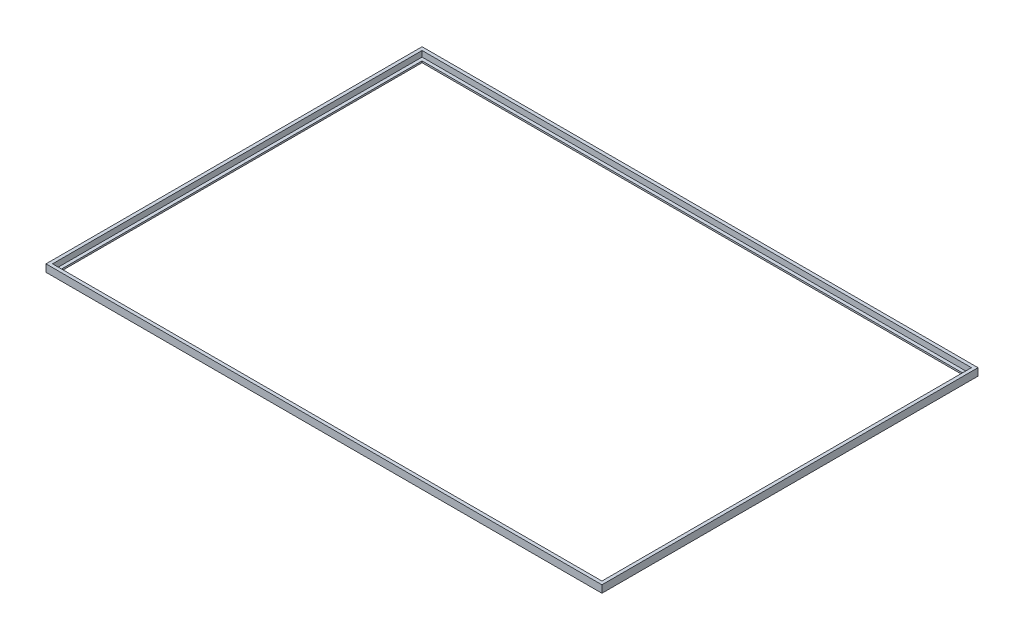
ISO-10303-21;
HEADER;
FILE_DESCRIPTION(('STEP AP214'),'2;1');
FILE_NAME('part.step','',(''),(''),'','','');
FILE_SCHEMA(('AUTOMOTIVE_DESIGN { 1 0 10303 214 1 1 1 1 }'));
ENDSEC;
DATA;
#1=APPLICATION_CONTEXT('core data for automotive mechanical design processes');
#2=APPLICATION_PROTOCOL_DEFINITION('international standard','automotive_design',2000,#1);
#3=PRODUCT_CONTEXT('',#1,'mechanical');
#4=PRODUCT('Part','Part','',(#3));
#5=PRODUCT_RELATED_PRODUCT_CATEGORY('part','',(#4));
#6=PRODUCT_DEFINITION_FORMATION('','',#4);
#7=PRODUCT_DEFINITION_CONTEXT('part definition',#1,'design');
#8=PRODUCT_DEFINITION('design','',#6,#7);
#9=PRODUCT_DEFINITION_SHAPE('','',#8);
#10=(LENGTH_UNIT() NAMED_UNIT(*) SI_UNIT(.MILLI.,.METRE.));
#11=(NAMED_UNIT(*) PLANE_ANGLE_UNIT() SI_UNIT($,.RADIAN.));
#12=(NAMED_UNIT(*) SI_UNIT($,.STERADIAN.) SOLID_ANGLE_UNIT());
#13=UNCERTAINTY_MEASURE_WITH_UNIT(LENGTH_MEASURE(1.E-05),#10,'distance_accuracy_value','');
#14=(GEOMETRIC_REPRESENTATION_CONTEXT(3) GLOBAL_UNCERTAINTY_ASSIGNED_CONTEXT((#13)) GLOBAL_UNIT_ASSIGNED_CONTEXT((#10,
#11,#12)) REPRESENTATION_CONTEXT('',''));
#15=CARTESIAN_POINT('',(0.,0.,0.));
#16=DIRECTION('',(0.,0.,1.));
#17=DIRECTION('',(1.,0.,0.));
#18=AXIS2_PLACEMENT_3D('',#15,#16,#17);
#19=CARTESIAN_POINT('',(2.,2.75,-2.));
#20=DIRECTION('',(1.,0.,0.));
#21=DIRECTION('',(0.,0.,-1.));
#22=AXIS2_PLACEMENT_3D('',#19,#20,#21);
#23=PLANE('',#22);
#24=DIRECTION('',(0.,-1.,0.));
#25=VECTOR('',#24,1.);
#26=CARTESIAN_POINT('',(2.,2.75,-2.));
#27=LINE('',#26,#25);
#28=CARTESIAN_POINT('',(2.,1.,-2.));
#29=VERTEX_POINT('',#28);
#30=CARTESIAN_POINT('',(2.,0.5,-2.));
#31=VERTEX_POINT('',#30);
#32=EDGE_CURVE('E209',#29,#31,#27,.T.);
#33=ORIENTED_EDGE('',*,*,#32,.T.);
#34=DIRECTION('',(0.,0.,-1.));
#35=VECTOR('',#34,1.);
#36=CARTESIAN_POINT('',(2.,0.5,-2.));
#37=LINE('',#36,#35);
#38=CARTESIAN_POINT('',(2.,0.5,-113.));
#39=VERTEX_POINT('',#38);
#40=EDGE_CURVE('E256',#31,#39,#37,.T.);
#41=ORIENTED_EDGE('',*,*,#40,.T.);
#42=DIRECTION('',(0.,-1.,0.));
#43=VECTOR('',#42,1.);
#44=CARTESIAN_POINT('',(2.,2.75,-113.));
#45=LINE('',#44,#43);
#46=CARTESIAN_POINT('',(2.,1.,-113.));
#47=VERTEX_POINT('',#46);
#48=EDGE_CURVE('E200',#47,#39,#45,.T.);
#49=ORIENTED_EDGE('',*,*,#48,.F.);
#50=DIRECTION('',(0.,0.,1.));
#51=VECTOR('',#50,1.);
#52=CARTESIAN_POINT('',(2.,1.,-2.));
#53=LINE('',#52,#51);
#54=EDGE_CURVE('E197',#47,#29,#53,.T.);
#55=ORIENTED_EDGE('',*,*,#54,.T.);
#56=EDGE_LOOP('',(#33,#41,#49,#55));
#57=FACE_BOUND('',#56,.T.);
#58=ADVANCED_FACE('F32',(#57),#23,.T.);
#59=CARTESIAN_POINT('',(2.,2.75,-2.));
#60=DIRECTION('',(0.,0.,-1.));
#61=DIRECTION('',(-1.,0.,0.));
#62=AXIS2_PLACEMENT_3D('',#59,#60,#61);
#63=PLANE('',#62);
#64=DIRECTION('',(0.,-1.,0.));
#65=VECTOR('',#64,1.);
#66=CARTESIAN_POINT('',(168.,2.75,-2.));
#67=LINE('',#66,#65);
#68=CARTESIAN_POINT('',(168.,1.,-2.));
#69=VERTEX_POINT('',#68);
#70=CARTESIAN_POINT('',(168.,0.5,-2.));
#71=VERTEX_POINT('',#70);
#72=EDGE_CURVE('E206',#69,#71,#67,.T.);
#73=ORIENTED_EDGE('',*,*,#72,.T.);
#74=DIRECTION('',(-1.,0.,0.));
#75=VECTOR('',#74,1.);
#76=CARTESIAN_POINT('',(2.,0.5,-2.));
#77=LINE('',#76,#75);
#78=EDGE_CURVE('E254',#71,#31,#77,.T.);
#79=ORIENTED_EDGE('',*,*,#78,.T.);
#80=ORIENTED_EDGE('',*,*,#32,.F.);
#81=DIRECTION('',(1.,0.,0.));
#82=VECTOR('',#81,1.);
#83=CARTESIAN_POINT('',(2.,1.,-2.));
#84=LINE('',#83,#82);
#85=EDGE_CURVE('E194',#29,#69,#84,.T.);
#86=ORIENTED_EDGE('',*,*,#85,.T.);
#87=EDGE_LOOP('',(#73,#79,#80,#86));
#88=FACE_BOUND('',#87,.T.);
#89=ADVANCED_FACE('F323',(#88),#63,.T.);
#90=CARTESIAN_POINT('',(168.,2.75,-2.));
#91=DIRECTION('',(-1.,0.,0.));
#92=DIRECTION('',(0.,0.,1.));
#93=AXIS2_PLACEMENT_3D('',#90,#91,#92);
#94=PLANE('',#93);
#95=DIRECTION('',(0.,-1.,0.));
#96=VECTOR('',#95,1.);
#97=CARTESIAN_POINT('',(168.,2.75,-113.));
#98=LINE('',#97,#96);
#99=CARTESIAN_POINT('',(168.,1.,-113.));
#100=VERTEX_POINT('',#99);
#101=CARTESIAN_POINT('',(168.,0.5,-113.));
#102=VERTEX_POINT('',#101);
#103=EDGE_CURVE('E203',#100,#102,#98,.T.);
#104=ORIENTED_EDGE('',*,*,#103,.T.);
#105=DIRECTION('',(0.,0.,1.));
#106=VECTOR('',#105,1.);
#107=CARTESIAN_POINT('',(168.,0.5,-2.));
#108=LINE('',#107,#106);
#109=EDGE_CURVE('E251',#102,#71,#108,.T.);
#110=ORIENTED_EDGE('',*,*,#109,.T.);
#111=ORIENTED_EDGE('',*,*,#72,.F.);
#112=DIRECTION('',(0.,0.,-1.));
#113=VECTOR('',#112,1.);
#114=CARTESIAN_POINT('',(168.,1.,-2.));
#115=LINE('',#114,#113);
#116=EDGE_CURVE('E188',#69,#100,#115,.T.);
#117=ORIENTED_EDGE('',*,*,#116,.T.);
#118=EDGE_LOOP('',(#104,#110,#111,#117));
#119=FACE_BOUND('',#118,.T.);
#120=ADVANCED_FACE('F329',(#119),#94,.T.);
#121=CARTESIAN_POINT('',(2.,2.75,-113.));
#122=DIRECTION('',(0.,0.,1.));
#123=DIRECTION('',(1.,0.,0.));
#124=AXIS2_PLACEMENT_3D('',#121,#122,#123);
#125=PLANE('',#124);
#126=ORIENTED_EDGE('',*,*,#48,.T.);
#127=DIRECTION('',(1.,0.,0.));
#128=VECTOR('',#127,1.);
#129=CARTESIAN_POINT('',(2.,0.5,-113.));
#130=LINE('',#129,#128);
#131=EDGE_CURVE('E258',#39,#102,#130,.T.);
#132=ORIENTED_EDGE('',*,*,#131,.T.);
#133=ORIENTED_EDGE('',*,*,#103,.F.);
#134=DIRECTION('',(-1.,0.,0.));
#135=VECTOR('',#134,1.);
#136=CARTESIAN_POINT('',(2.,1.,-113.));
#137=LINE('',#136,#135);
#138=EDGE_CURVE('E230',#100,#47,#137,.T.);
#139=ORIENTED_EDGE('',*,*,#138,.T.);
#140=EDGE_LOOP('',(#126,#132,#133,#139));
#141=FACE_BOUND('',#140,.T.);
#142=ADVANCED_FACE('F335',(#141),#125,.T.);
#143=CARTESIAN_POINT('',(0.,2.75,0.));
#144=DIRECTION('',(0.,-1.,0.));
#145=DIRECTION('',(0.,0.,-1.));
#146=AXIS2_PLACEMENT_3D('',#143,#144,#145);
#147=PLANE('',#146);
#148=DIRECTION('',(0.,0.,-1.));
#149=VECTOR('',#148,1.);
#150=CARTESIAN_POINT('',(169.,2.75,-1.));
#151=LINE('',#150,#149);
#152=CARTESIAN_POINT('',(169.,2.75,-1.));
#153=VERTEX_POINT('',#152);
#154=CARTESIAN_POINT('',(169.,2.75,-114.));
#155=VERTEX_POINT('',#154);
#156=EDGE_CURVE('E181',#153,#155,#151,.T.);
#157=ORIENTED_EDGE('',*,*,#156,.F.);
#158=DIRECTION('',(1.,0.,0.));
#159=VECTOR('',#158,1.);
#160=CARTESIAN_POINT('',(1.,2.75,-1.));
#161=LINE('',#160,#159);
#162=CARTESIAN_POINT('',(1.,2.75,-1.));
#163=VERTEX_POINT('',#162);
#164=EDGE_CURVE('E155',#163,#153,#161,.T.);
#165=ORIENTED_EDGE('',*,*,#164,.F.);
#166=DIRECTION('',(0.,0.,1.));
#167=VECTOR('',#166,1.);
#168=CARTESIAN_POINT('',(1.,2.75,-114.));
#169=LINE('',#168,#167);
#170=CARTESIAN_POINT('',(1.,2.75,-114.));
#171=VERTEX_POINT('',#170);
#172=EDGE_CURVE('E172',#171,#163,#169,.T.);
#173=ORIENTED_EDGE('',*,*,#172,.F.);
#174=DIRECTION('',(-1.,0.,0.));
#175=VECTOR('',#174,1.);
#176=CARTESIAN_POINT('',(169.,2.75,-114.));
#177=LINE('',#176,#175);
#178=EDGE_CURVE('E175',#155,#171,#177,.T.);
#179=ORIENTED_EDGE('',*,*,#178,.F.);
#180=EDGE_LOOP('',(#157,#165,#173,#179));
#181=FACE_BOUND('',#180,.T.);
#182=DIRECTION('',(0.,0.,1.));
#183=VECTOR('',#182,1.);
#184=CARTESIAN_POINT('',(0.,2.75,0.));
#185=LINE('',#184,#183);
#186=CARTESIAN_POINT('',(0.,2.75,-115.));
#187=VERTEX_POINT('',#186);
#188=CARTESIAN_POINT('',(0.,2.75,0.));
#189=VERTEX_POINT('',#188);
#190=EDGE_CURVE('E212',#187,#189,#185,.T.);
#191=ORIENTED_EDGE('',*,*,#190,.T.);
#192=DIRECTION('',(1.,0.,0.));
#193=VECTOR('',#192,1.);
#194=CARTESIAN_POINT('',(0.,2.75,0.));
#195=LINE('',#194,#193);
#196=CARTESIAN_POINT('',(170.,2.75,0.));
#197=VERTEX_POINT('',#196);
#198=EDGE_CURVE('E215',#189,#197,#195,.T.);
#199=ORIENTED_EDGE('',*,*,#198,.T.);
#200=DIRECTION('',(0.,0.,-1.));
#201=VECTOR('',#200,1.);
#202=CARTESIAN_POINT('',(170.,2.75,0.));
#203=LINE('',#202,#201);
#204=CARTESIAN_POINT('',(170.,2.75,-115.));
#205=VERTEX_POINT('',#204);
#206=EDGE_CURVE('E217',#197,#205,#203,.T.);
#207=ORIENTED_EDGE('',*,*,#206,.T.);
#208=DIRECTION('',(-1.,0.,0.));
#209=VECTOR('',#208,1.);
#210=CARTESIAN_POINT('',(0.,2.75,-115.));
#211=LINE('',#210,#209);
#212=EDGE_CURVE('E219',#205,#187,#211,.T.);
#213=ORIENTED_EDGE('',*,*,#212,.T.);
#214=EDGE_LOOP('',(#191,#199,#207,#213));
#215=FACE_BOUND('',#214,.T.);
#216=ADVANCED_FACE('F307',(#181,#215),#147,.F.);
#217=CARTESIAN_POINT('',(0.,0.,0.));
#218=DIRECTION('',(0.,-1.,0.));
#219=DIRECTION('',(0.,0.,-1.));
#220=AXIS2_PLACEMENT_3D('',#217,#218,#219);
#221=PLANE('',#220);
#222=DIRECTION('',(1.,0.,0.));
#223=VECTOR('',#222,1.);
#224=CARTESIAN_POINT('',(0.,0.,-1.5));
#225=LINE('',#224,#223);
#226=CARTESIAN_POINT('',(1.5,0.,-1.5));
#227=VERTEX_POINT('',#226);
#228=CARTESIAN_POINT('',(168.5,0.,-1.5));
#229=VERTEX_POINT('',#228);
#230=EDGE_CURVE('E246',#227,#229,#225,.T.);
#231=ORIENTED_EDGE('',*,*,#230,.T.);
#232=DIRECTION('',(0.,0.,-1.));
#233=VECTOR('',#232,1.);
#234=CARTESIAN_POINT('',(168.5,0.,0.));
#235=LINE('',#234,#233);
#236=CARTESIAN_POINT('',(168.5,0.,-113.5));
#237=VERTEX_POINT('',#236);
#238=EDGE_CURVE('E248',#229,#237,#235,.T.);
#239=ORIENTED_EDGE('',*,*,#238,.T.);
#240=DIRECTION('',(-1.,0.,0.));
#241=VECTOR('',#240,1.);
#242=CARTESIAN_POINT('',(0.,0.,-113.5));
#243=LINE('',#242,#241);
#244=CARTESIAN_POINT('',(1.5,0.,-113.5));
#245=VERTEX_POINT('',#244);
#246=EDGE_CURVE('E242',#237,#245,#243,.T.);
#247=ORIENTED_EDGE('',*,*,#246,.T.);
#248=DIRECTION('',(0.,0.,1.));
#249=VECTOR('',#248,1.);
#250=CARTESIAN_POINT('',(1.5,0.,0.));
#251=LINE('',#250,#249);
#252=EDGE_CURVE('E244',#245,#227,#251,.T.);
#253=ORIENTED_EDGE('',*,*,#252,.T.);
#254=EDGE_LOOP('',(#231,#239,#247,#253));
#255=FACE_BOUND('',#254,.T.);
#256=DIRECTION('',(0.,0.,1.));
#257=VECTOR('',#256,1.);
#258=CARTESIAN_POINT('',(169.5,0.,0.));
#259=LINE('',#258,#257);
#260=CARTESIAN_POINT('',(169.5,0.,-114.5));
#261=VERTEX_POINT('',#260);
#262=CARTESIAN_POINT('',(169.5,0.,-0.5));
#263=VERTEX_POINT('',#262);
#264=EDGE_CURVE('E237',#261,#263,#259,.T.);
#265=ORIENTED_EDGE('',*,*,#264,.T.);
#266=DIRECTION('',(-1.,0.,0.));
#267=VECTOR('',#266,1.);
#268=CARTESIAN_POINT('',(0.,0.,-0.5));
#269=LINE('',#268,#267);
#270=CARTESIAN_POINT('',(0.5,0.,-0.5));
#271=VERTEX_POINT('',#270);
#272=EDGE_CURVE('E239',#263,#271,#269,.T.);
#273=ORIENTED_EDGE('',*,*,#272,.T.);
#274=DIRECTION('',(0.,0.,-1.));
#275=VECTOR('',#274,1.);
#276=CARTESIAN_POINT('',(0.5,0.,-115.));
#277=LINE('',#276,#275);
#278=CARTESIAN_POINT('',(0.5,0.,-114.5));
#279=VERTEX_POINT('',#278);
#280=EDGE_CURVE('E233',#271,#279,#277,.T.);
#281=ORIENTED_EDGE('',*,*,#280,.T.);
#282=DIRECTION('',(1.,0.,0.));
#283=VECTOR('',#282,1.);
#284=CARTESIAN_POINT('',(170.,0.,-114.5));
#285=LINE('',#284,#283);
#286=EDGE_CURVE('E235',#279,#261,#285,.T.);
#287=ORIENTED_EDGE('',*,*,#286,.T.);
#288=EDGE_LOOP('',(#265,#273,#281,#287));
#289=FACE_BOUND('',#288,.T.);
#290=ADVANCED_FACE('F292',(#255,#289),#221,.T.);
#291=CARTESIAN_POINT('',(0.,2.75,0.));
#292=DIRECTION('',(1.,0.,0.));
#293=DIRECTION('',(0.,0.,-1.));
#294=AXIS2_PLACEMENT_3D('',#291,#292,#293);
#295=PLANE('',#294);
#296=DIRECTION('',(0.,-1.,0.));
#297=VECTOR('',#296,1.);
#298=CARTESIAN_POINT('',(0.,2.75,-115.));
#299=LINE('',#298,#297);
#300=CARTESIAN_POINT('',(0.,0.5,-115.));
#301=VERTEX_POINT('',#300);
#302=EDGE_CURVE('E221',#187,#301,#299,.T.);
#303=ORIENTED_EDGE('',*,*,#302,.T.);
#304=DIRECTION('',(0.,0.,1.));
#305=VECTOR('',#304,1.);
#306=CARTESIAN_POINT('',(0.,0.5,0.));
#307=LINE('',#306,#305);
#308=CARTESIAN_POINT('',(0.,0.5,0.));
#309=VERTEX_POINT('',#308);
#310=EDGE_CURVE('E11',#301,#309,#307,.T.);
#311=ORIENTED_EDGE('',*,*,#310,.T.);
#312=DIRECTION('',(0.,-1.,0.));
#313=VECTOR('',#312,1.);
#314=CARTESIAN_POINT('',(0.,2.75,0.));
#315=LINE('',#314,#313);
#316=EDGE_CURVE('E227',#189,#309,#315,.T.);
#317=ORIENTED_EDGE('',*,*,#316,.F.);
#318=ORIENTED_EDGE('',*,*,#190,.F.);
#319=EDGE_LOOP('',(#303,#311,#317,#318));
#320=FACE_BOUND('',#319,.T.);
#321=ADVANCED_FACE('F310',(#320),#295,.F.);
#322=CARTESIAN_POINT('',(0.,2.75,0.));
#323=DIRECTION('',(0.,0.,-1.));
#324=DIRECTION('',(-1.,0.,0.));
#325=AXIS2_PLACEMENT_3D('',#322,#323,#324);
#326=PLANE('',#325);
#327=ORIENTED_EDGE('',*,*,#316,.T.);
#328=DIRECTION('',(1.,0.,0.));
#329=VECTOR('',#328,1.);
#330=CARTESIAN_POINT('',(170.,0.5,0.));
#331=LINE('',#330,#329);
#332=CARTESIAN_POINT('',(170.,0.5,0.));
#333=VERTEX_POINT('',#332);
#334=EDGE_CURVE('E260',#309,#333,#331,.T.);
#335=ORIENTED_EDGE('',*,*,#334,.T.);
#336=DIRECTION('',(0.,-1.,0.));
#337=VECTOR('',#336,1.);
#338=CARTESIAN_POINT('',(170.,2.75,0.));
#339=LINE('',#338,#337);
#340=EDGE_CURVE('E225',#197,#333,#339,.T.);
#341=ORIENTED_EDGE('',*,*,#340,.F.);
#342=ORIENTED_EDGE('',*,*,#198,.F.);
#343=EDGE_LOOP('',(#327,#335,#341,#342));
#344=FACE_BOUND('',#343,.T.);
#345=ADVANCED_FACE('F301',(#344),#326,.F.);
#346=CARTESIAN_POINT('',(170.,2.75,0.));
#347=DIRECTION('',(-1.,0.,0.));
#348=DIRECTION('',(0.,0.,1.));
#349=AXIS2_PLACEMENT_3D('',#346,#347,#348);
#350=PLANE('',#349);
#351=ORIENTED_EDGE('',*,*,#340,.T.);
#352=DIRECTION('',(0.,0.,-1.));
#353=VECTOR('',#352,1.);
#354=CARTESIAN_POINT('',(170.,0.5,-115.));
#355=LINE('',#354,#353);
#356=CARTESIAN_POINT('',(170.,0.5,-115.));
#357=VERTEX_POINT('',#356);
#358=EDGE_CURVE('E56',#333,#357,#355,.T.);
#359=ORIENTED_EDGE('',*,*,#358,.T.);
#360=DIRECTION('',(0.,-1.,0.));
#361=VECTOR('',#360,1.);
#362=CARTESIAN_POINT('',(170.,2.75,-115.));
#363=LINE('',#362,#361);
#364=EDGE_CURVE('E223',#205,#357,#363,.T.);
#365=ORIENTED_EDGE('',*,*,#364,.F.);
#366=ORIENTED_EDGE('',*,*,#206,.F.);
#367=EDGE_LOOP('',(#351,#359,#365,#366));
#368=FACE_BOUND('',#367,.T.);
#369=ADVANCED_FACE('F304',(#368),#350,.F.);
#370=CARTESIAN_POINT('',(0.,2.75,-115.));
#371=DIRECTION('',(0.,0.,1.));
#372=DIRECTION('',(1.,0.,0.));
#373=AXIS2_PLACEMENT_3D('',#370,#371,#372);
#374=PLANE('',#373);
#375=ORIENTED_EDGE('',*,*,#364,.T.);
#376=DIRECTION('',(-1.,0.,0.));
#377=VECTOR('',#376,1.);
#378=CARTESIAN_POINT('',(0.,0.5,-115.));
#379=LINE('',#378,#377);
#380=EDGE_CURVE('E41',#357,#301,#379,.T.);
#381=ORIENTED_EDGE('',*,*,#380,.T.);
#382=ORIENTED_EDGE('',*,*,#302,.F.);
#383=ORIENTED_EDGE('',*,*,#212,.F.);
#384=EDGE_LOOP('',(#375,#381,#382,#383));
#385=FACE_BOUND('',#384,.T.);
#386=ADVANCED_FACE('F311',(#385),#374,.F.);
#387=CARTESIAN_POINT('',(1.,1.,-1.));
#388=DIRECTION('',(0.,0.,1.));
#389=DIRECTION('',(1.,0.,0.));
#390=AXIS2_PLACEMENT_3D('',#387,#388,#389);
#391=PLANE('',#390);
#392=ORIENTED_EDGE('',*,*,#164,.T.);
#393=DIRECTION('',(0.,1.,0.));
#394=VECTOR('',#393,1.);
#395=CARTESIAN_POINT('',(169.,1.,-1.));
#396=LINE('',#395,#394);
#397=CARTESIAN_POINT('',(169.,1.,-1.));
#398=VERTEX_POINT('',#397);
#399=EDGE_CURVE('E148',#398,#153,#396,.T.);
#400=ORIENTED_EDGE('',*,*,#399,.F.);
#401=DIRECTION('',(1.,0.,0.));
#402=VECTOR('',#401,1.);
#403=CARTESIAN_POINT('',(1.,1.,-1.));
#404=LINE('',#403,#402);
#405=CARTESIAN_POINT('',(1.,1.,-1.));
#406=VERTEX_POINT('',#405);
#407=EDGE_CURVE('E152',#406,#398,#404,.T.);
#408=ORIENTED_EDGE('',*,*,#407,.F.);
#409=DIRECTION('',(0.,1.,0.));
#410=VECTOR('',#409,1.);
#411=CARTESIAN_POINT('',(1.,1.,-1.));
#412=LINE('',#411,#410);
#413=EDGE_CURVE('E186',#406,#163,#412,.T.);
#414=ORIENTED_EDGE('',*,*,#413,.T.);
#415=EDGE_LOOP('',(#392,#400,#408,#414));
#416=FACE_BOUND('',#415,.T.);
#417=ADVANCED_FACE('F150',(#416),#391,.F.);
#418=CARTESIAN_POINT('',(1.,1.,-114.));
#419=DIRECTION('',(-1.,0.,0.));
#420=DIRECTION('',(0.,0.,1.));
#421=AXIS2_PLACEMENT_3D('',#418,#419,#420);
#422=PLANE('',#421);
#423=ORIENTED_EDGE('',*,*,#172,.T.);
#424=ORIENTED_EDGE('',*,*,#413,.F.);
#425=DIRECTION('',(0.,0.,1.));
#426=VECTOR('',#425,1.);
#427=CARTESIAN_POINT('',(1.,1.,-114.));
#428=LINE('',#427,#426);
#429=CARTESIAN_POINT('',(1.,1.,-114.));
#430=VERTEX_POINT('',#429);
#431=EDGE_CURVE('E160',#430,#406,#428,.T.);
#432=ORIENTED_EDGE('',*,*,#431,.F.);
#433=DIRECTION('',(0.,1.,0.));
#434=VECTOR('',#433,1.);
#435=CARTESIAN_POINT('',(1.,1.,-114.));
#436=LINE('',#435,#434);
#437=EDGE_CURVE('E189',#430,#171,#436,.T.);
#438=ORIENTED_EDGE('',*,*,#437,.T.);
#439=EDGE_LOOP('',(#423,#424,#432,#438));
#440=FACE_BOUND('',#439,.T.);
#441=ADVANCED_FACE('F318',(#440),#422,.F.);
#442=CARTESIAN_POINT('',(169.,1.,-114.));
#443=DIRECTION('',(0.,0.,-1.));
#444=DIRECTION('',(-1.,0.,0.));
#445=AXIS2_PLACEMENT_3D('',#442,#443,#444);
#446=PLANE('',#445);
#447=ORIENTED_EDGE('',*,*,#178,.T.);
#448=ORIENTED_EDGE('',*,*,#437,.F.);
#449=DIRECTION('',(-1.,0.,0.));
#450=VECTOR('',#449,1.);
#451=CARTESIAN_POINT('',(169.,1.,-114.));
#452=LINE('',#451,#450);
#453=CARTESIAN_POINT('',(169.,1.,-114.));
#454=VERTEX_POINT('',#453);
#455=EDGE_CURVE('E168',#454,#430,#452,.T.);
#456=ORIENTED_EDGE('',*,*,#455,.F.);
#457=DIRECTION('',(0.,1.,0.));
#458=VECTOR('',#457,1.);
#459=CARTESIAN_POINT('',(169.,1.,-114.));
#460=LINE('',#459,#458);
#461=EDGE_CURVE('E159',#454,#155,#460,.T.);
#462=ORIENTED_EDGE('',*,*,#461,.T.);
#463=EDGE_LOOP('',(#447,#448,#456,#462));
#464=FACE_BOUND('',#463,.T.);
#465=ADVANCED_FACE('F378',(#464),#446,.F.);
#466=CARTESIAN_POINT('',(169.,1.,-1.));
#467=DIRECTION('',(1.,0.,0.));
#468=DIRECTION('',(0.,0.,-1.));
#469=AXIS2_PLACEMENT_3D('',#466,#467,#468);
#470=PLANE('',#469);
#471=ORIENTED_EDGE('',*,*,#156,.T.);
#472=ORIENTED_EDGE('',*,*,#461,.F.);
#473=DIRECTION('',(0.,0.,-1.));
#474=VECTOR('',#473,1.);
#475=CARTESIAN_POINT('',(169.,1.,-1.));
#476=LINE('',#475,#474);
#477=EDGE_CURVE('E163',#398,#454,#476,.T.);
#478=ORIENTED_EDGE('',*,*,#477,.F.);
#479=ORIENTED_EDGE('',*,*,#399,.T.);
#480=EDGE_LOOP('',(#471,#472,#478,#479));
#481=FACE_BOUND('',#480,.T.);
#482=ADVANCED_FACE('F164',(#481),#470,.F.);
#483=CARTESIAN_POINT('',(0.,1.,0.));
#484=DIRECTION('',(0.,1.,0.));
#485=DIRECTION('',(0.,0.,1.));
#486=AXIS2_PLACEMENT_3D('',#483,#484,#485);
#487=PLANE('',#486);
#488=ORIENTED_EDGE('',*,*,#138,.F.);
#489=ORIENTED_EDGE('',*,*,#116,.F.);
#490=ORIENTED_EDGE('',*,*,#85,.F.);
#491=ORIENTED_EDGE('',*,*,#54,.F.);
#492=EDGE_LOOP('',(#488,#489,#490,#491));
#493=FACE_BOUND('',#492,.T.);
#494=ORIENTED_EDGE('',*,*,#407,.T.);
#495=ORIENTED_EDGE('',*,*,#477,.T.);
#496=ORIENTED_EDGE('',*,*,#455,.T.);
#497=ORIENTED_EDGE('',*,*,#431,.T.);
#498=EDGE_LOOP('',(#494,#495,#496,#497));
#499=FACE_BOUND('',#498,.T.);
#500=ADVANCED_FACE('F170',(#493,#499),#487,.T.);
#501=CARTESIAN_POINT('',(1.5,0.,0.));
#502=DIRECTION('',(-0.707106781186547,0.707106781186547,0.));
#503=DIRECTION('',(0.,0.,1.));
#504=AXIS2_PLACEMENT_3D('',#501,#502,#503);
#505=PLANE('',#504);
#506=DIRECTION('',(-0.577350269189626,-0.577350269189626,-0.577350269189626));
#507=VECTOR('',#506,1.);
#508=CARTESIAN_POINT('',(39.3333333333333,37.8333333333333,-75.6666666666667));
#509=LINE('',#508,#507);
#510=EDGE_CURVE('E269',#39,#245,#509,.T.);
#511=ORIENTED_EDGE('',*,*,#510,.F.);
#512=ORIENTED_EDGE('',*,*,#40,.F.);
#513=DIRECTION('',(-0.577350269189626,-0.577350269189626,0.577350269189626));
#514=VECTOR('',#513,1.);
#515=CARTESIAN_POINT('',(1.,-0.5,-1.));
#516=LINE('',#515,#514);
#517=EDGE_CURVE('E182',#227,#31,#516,.F.);
#518=ORIENTED_EDGE('',*,*,#517,.F.);
#519=ORIENTED_EDGE('',*,*,#252,.F.);
#520=EDGE_LOOP('',(#511,#512,#518,#519));
#521=FACE_BOUND('',#520,.T.);
#522=ADVANCED_FACE('F361',(#521),#505,.F.);
#523=CARTESIAN_POINT('',(0.,0.,-1.5));
#524=DIRECTION('',(0.,0.707106781186547,0.707106781186547));
#525=DIRECTION('',(1.,0.,0.));
#526=AXIS2_PLACEMENT_3D('',#523,#524,#525);
#527=PLANE('',#526);
#528=ORIENTED_EDGE('',*,*,#517,.T.);
#529=ORIENTED_EDGE('',*,*,#78,.F.);
#530=DIRECTION('',(0.577350269189626,-0.577350269189626,0.577350269189626));
#531=VECTOR('',#530,1.);
#532=CARTESIAN_POINT('',(169.,-0.5,-1.));
#533=LINE('',#532,#531);
#534=EDGE_CURVE('E267',#229,#71,#533,.F.);
#535=ORIENTED_EDGE('',*,*,#534,.F.);
#536=ORIENTED_EDGE('',*,*,#230,.F.);
#537=EDGE_LOOP('',(#528,#529,#535,#536));
#538=FACE_BOUND('',#537,.T.);
#539=ADVANCED_FACE('F350',(#538),#527,.F.);
#540=CARTESIAN_POINT('',(0.,0.,-113.5));
#541=DIRECTION('',(0.,0.707106781186547,-0.707106781186547));
#542=DIRECTION('',(-1.,0.,0.));
#543=AXIS2_PLACEMENT_3D('',#540,#541,#542);
#544=PLANE('',#543);
#545=ORIENTED_EDGE('',*,*,#510,.T.);
#546=ORIENTED_EDGE('',*,*,#246,.F.);
#547=DIRECTION('',(-0.577350269189626,0.577350269189626,0.577350269189626));
#548=VECTOR('',#547,1.);
#549=CARTESIAN_POINT('',(130.666666666667,37.8333333333333,-75.6666666666667));
#550=LINE('',#549,#548);
#551=EDGE_CURVE('E265',#102,#237,#550,.F.);
#552=ORIENTED_EDGE('',*,*,#551,.F.);
#553=ORIENTED_EDGE('',*,*,#131,.F.);
#554=EDGE_LOOP('',(#545,#546,#552,#553));
#555=FACE_BOUND('',#554,.T.);
#556=ADVANCED_FACE('F358',(#555),#544,.F.);
#557=CARTESIAN_POINT('',(168.5,0.,0.));
#558=DIRECTION('',(0.707106781186547,0.707106781186547,0.));
#559=DIRECTION('',(0.,0.,-1.));
#560=AXIS2_PLACEMENT_3D('',#557,#558,#559);
#561=PLANE('',#560);
#562=ORIENTED_EDGE('',*,*,#534,.T.);
#563=ORIENTED_EDGE('',*,*,#109,.F.);
#564=ORIENTED_EDGE('',*,*,#551,.T.);
#565=ORIENTED_EDGE('',*,*,#238,.F.);
#566=EDGE_LOOP('',(#562,#563,#564,#565));
#567=FACE_BOUND('',#566,.T.);
#568=ADVANCED_FACE('F353',(#567),#561,.F.);
#569=CARTESIAN_POINT('',(0.,0.5,-115.));
#570=DIRECTION('',(0.,-0.707106781186547,-0.707106781186547));
#571=DIRECTION('',(1.,0.,0.));
#572=AXIS2_PLACEMENT_3D('',#569,#570,#571);
#573=PLANE('',#572);
#574=DIRECTION('',(-0.577350269189626,-0.577350269189626,0.577350269189626));
#575=VECTOR('',#574,1.);
#576=CARTESIAN_POINT('',(113.333333333333,-56.1666666666667,-58.3333333333333));
#577=LINE('',#576,#575);
#578=EDGE_CURVE('E277',#261,#357,#577,.F.);
#579=ORIENTED_EDGE('',*,*,#578,.F.);
#580=ORIENTED_EDGE('',*,*,#286,.F.);
#581=DIRECTION('',(0.577350269189626,-0.577350269189626,0.577350269189626));
#582=VECTOR('',#581,1.);
#583=CARTESIAN_POINT('',(38.3333333333333,-37.8333333333333,-76.6666666666667));
#584=LINE('',#583,#582);
#585=EDGE_CURVE('E36',#301,#279,#584,.T.);
#586=ORIENTED_EDGE('',*,*,#585,.F.);
#587=ORIENTED_EDGE('',*,*,#380,.F.);
#588=EDGE_LOOP('',(#579,#580,#586,#587));
#589=FACE_BOUND('',#588,.T.);
#590=ADVANCED_FACE('F34',(#589),#573,.T.);
#591=CARTESIAN_POINT('',(0.,0.5,0.));
#592=DIRECTION('',(-0.707106781186547,-0.707106781186547,0.));
#593=DIRECTION('',(0.,0.,-1.));
#594=AXIS2_PLACEMENT_3D('',#591,#592,#593);
#595=PLANE('',#594);
#596=ORIENTED_EDGE('',*,*,#585,.T.);
#597=ORIENTED_EDGE('',*,*,#280,.F.);
#598=DIRECTION('',(-0.577350269189626,0.577350269189626,0.577350269189626));
#599=VECTOR('',#598,1.);
#600=CARTESIAN_POINT('',(0.,0.5,0.));
#601=LINE('',#600,#599);
#602=EDGE_CURVE('E276',#309,#271,#601,.F.);
#603=ORIENTED_EDGE('',*,*,#602,.F.);
#604=ORIENTED_EDGE('',*,*,#310,.F.);
#605=EDGE_LOOP('',(#596,#597,#603,#604));
#606=FACE_BOUND('',#605,.T.);
#607=ADVANCED_FACE('F287',(#606),#595,.T.);
#608=CARTESIAN_POINT('',(170.,0.5,0.));
#609=DIRECTION('',(0.707106781186547,-0.707106781186547,0.));
#610=DIRECTION('',(0.,0.,1.));
#611=AXIS2_PLACEMENT_3D('',#608,#609,#610);
#612=PLANE('',#611);
#613=ORIENTED_EDGE('',*,*,#578,.T.);
#614=ORIENTED_EDGE('',*,*,#358,.F.);
#615=DIRECTION('',(-0.577350269189626,-0.577350269189626,-0.577350269189626));
#616=VECTOR('',#615,1.);
#617=CARTESIAN_POINT('',(170.,0.5,0.));
#618=LINE('',#617,#616);
#619=EDGE_CURVE('E274',#263,#333,#618,.F.);
#620=ORIENTED_EDGE('',*,*,#619,.F.);
#621=ORIENTED_EDGE('',*,*,#264,.F.);
#622=EDGE_LOOP('',(#613,#614,#620,#621));
#623=FACE_BOUND('',#622,.T.);
#624=ADVANCED_FACE('F298',(#623),#612,.T.);
#625=CARTESIAN_POINT('',(0.,0.5,0.));
#626=DIRECTION('',(0.,-0.707106781186547,0.707106781186547));
#627=DIRECTION('',(-1.,0.,0.));
#628=AXIS2_PLACEMENT_3D('',#625,#626,#627);
#629=PLANE('',#628);
#630=ORIENTED_EDGE('',*,*,#602,.T.);
#631=ORIENTED_EDGE('',*,*,#272,.F.);
#632=ORIENTED_EDGE('',*,*,#619,.T.);
#633=ORIENTED_EDGE('',*,*,#334,.F.);
#634=EDGE_LOOP('',(#630,#631,#632,#633));
#635=FACE_BOUND('',#634,.T.);
#636=ADVANCED_FACE('F296',(#635),#629,.T.);
#637=CLOSED_SHELL('',(#58,#89,#120,#142,#216,#290,#321,#345,#369,#386,#417,#441,#465,#482,#500,
#522,#539,#556,#568,#590,#607,#624,#636));
#638=MANIFOLD_SOLID_BREP('B2',#637);
#639=ADVANCED_BREP_SHAPE_REPRESENTATION('',(#18,#638),#14);
#640=SHAPE_DEFINITION_REPRESENTATION(#9,#639);
ENDSEC;
END-ISO-10303-21;
